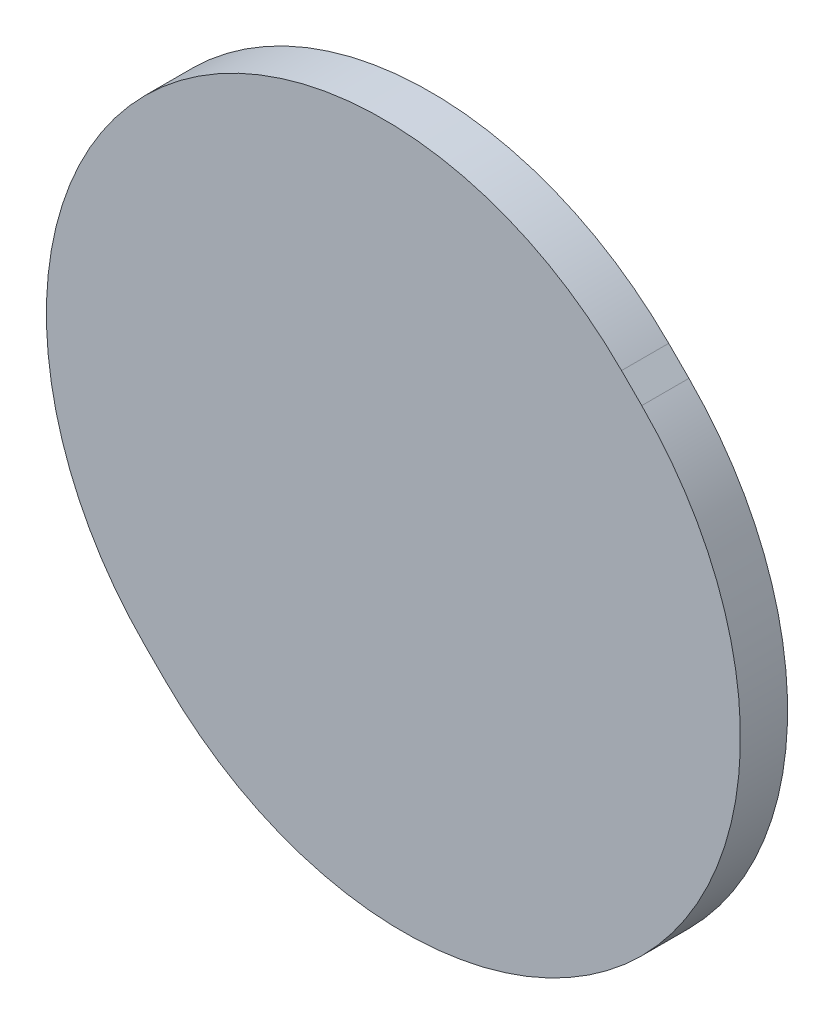
ISO-10303-21;
HEADER;
FILE_DESCRIPTION(('STEP AP214'),'2;1');
FILE_NAME('part.step','',(''),(''),'','','');
FILE_SCHEMA(('AUTOMOTIVE_DESIGN { 1 0 10303 214 1 1 1 1 }'));
ENDSEC;
DATA;
#1=APPLICATION_CONTEXT('core data for automotive mechanical design processes');
#2=APPLICATION_PROTOCOL_DEFINITION('international standard','automotive_design',2000,#1);
#3=PRODUCT_CONTEXT('',#1,'mechanical');
#4=PRODUCT('Part','Part','',(#3));
#5=PRODUCT_RELATED_PRODUCT_CATEGORY('part','',(#4));
#6=PRODUCT_DEFINITION_FORMATION('','',#4);
#7=PRODUCT_DEFINITION_CONTEXT('part definition',#1,'design');
#8=PRODUCT_DEFINITION('design','',#6,#7);
#9=PRODUCT_DEFINITION_SHAPE('','',#8);
#10=(LENGTH_UNIT() NAMED_UNIT(*) SI_UNIT(.MILLI.,.METRE.));
#11=(NAMED_UNIT(*) PLANE_ANGLE_UNIT() SI_UNIT($,.RADIAN.));
#12=(NAMED_UNIT(*) SI_UNIT($,.STERADIAN.) SOLID_ANGLE_UNIT());
#13=UNCERTAINTY_MEASURE_WITH_UNIT(LENGTH_MEASURE(1.E-05),#10,'distance_accuracy_value','');
#14=(GEOMETRIC_REPRESENTATION_CONTEXT(3) GLOBAL_UNCERTAINTY_ASSIGNED_CONTEXT((#13)) GLOBAL_UNIT_ASSIGNED_CONTEXT((#10,
#11,#12)) REPRESENTATION_CONTEXT('',''));
#15=CARTESIAN_POINT('',(0.,0.,0.));
#16=DIRECTION('',(0.,0.,1.));
#17=DIRECTION('',(1.,0.,0.));
#18=AXIS2_PLACEMENT_3D('',#15,#16,#17);
#19=CARTESIAN_POINT('',(145.168223,-116.711776,1.635));
#20=DIRECTION('',(0.,0.,1.));
#21=DIRECTION('',(1.,0.,0.));
#22=AXIS2_PLACEMENT_3D('',#19,#20,#21);
#23=PLANE('',#22);
#24=DIRECTION('',(0.707106781186048,-0.707106781187048,0.));
#25=VECTOR('',#24,1.);
#26=CARTESIAN_POINT('',(145.168223,-116.711776,1.635));
#27=LINE('',#26,#25);
#28=CARTESIAN_POINT('',(145.168223,-116.711776,1.635));
#29=VERTEX_POINT('',#28);
#30=CARTESIAN_POINT('',(145.183223,-116.726776,1.635));
#31=VERTEX_POINT('',#30);
#32=EDGE_CURVE('E80',#29,#31,#27,.T.);
#33=ORIENTED_EDGE('',*,*,#32,.T.);
#34=CARTESIAN_POINT('',(145.3599995,-116.5499995,1.635));
#35=DIRECTION('',(0.,0.,1.));
#36=DIRECTION('',(-0.707106781186548,-0.707106781186548,0.));
#37=AXIS2_PLACEMENT_3D('',#34,#35,#36);
#38=CIRCLE('',#37,0.249999723809);
#39=CARTESIAN_POINT('',(145.536776,-116.373223,1.635));
#40=VERTEX_POINT('',#39);
#41=EDGE_CURVE('E78',#31,#40,#38,.T.);
#42=ORIENTED_EDGE('',*,*,#41,.T.);
#43=DIRECTION('',(-0.707106781187048,0.707106781186048,0.));
#44=VECTOR('',#43,1.);
#45=CARTESIAN_POINT('',(145.536776,-116.373223,1.635));
#46=LINE('',#45,#44);
#47=CARTESIAN_POINT('',(145.521776,-116.358223,1.635));
#48=VERTEX_POINT('',#47);
#49=EDGE_CURVE('E66',#40,#48,#46,.T.);
#50=ORIENTED_EDGE('',*,*,#49,.T.);
#51=CARTESIAN_POINT('',(145.3449995,-116.5349995,1.635));
#52=DIRECTION('',(0.,0.,1.));
#53=DIRECTION('',(0.707106781186548,0.707106781186548,0.));
#54=AXIS2_PLACEMENT_3D('',#51,#52,#53);
#55=CIRCLE('',#54,0.249999723809);
#56=EDGE_CURVE('E11',#48,#29,#55,.T.);
#57=ORIENTED_EDGE('',*,*,#56,.T.);
#58=EDGE_LOOP('',(#33,#42,#50,#57));
#59=FACE_BOUND('',#58,.T.);
#60=ADVANCED_FACE('F17',(#59),#23,.T.);
#61=CARTESIAN_POINT('',(145.168223,-116.711776,1.6));
#62=DIRECTION('',(0.,0.,1.));
#63=DIRECTION('',(1.,0.,0.));
#64=AXIS2_PLACEMENT_3D('',#61,#62,#63);
#65=PLANE('',#64);
#66=CARTESIAN_POINT('',(145.3449995,-116.5349995,1.6));
#67=DIRECTION('',(0.,0.,1.));
#68=DIRECTION('',(0.707106781186548,0.707106781186548,0.));
#69=AXIS2_PLACEMENT_3D('',#66,#67,#68);
#70=CIRCLE('',#69,0.249999723809);
#71=CARTESIAN_POINT('',(145.521776,-116.358223,1.6));
#72=VERTEX_POINT('',#71);
#73=CARTESIAN_POINT('',(145.168223,-116.711776,1.6));
#74=VERTEX_POINT('',#73);
#75=EDGE_CURVE('E27',#72,#74,#70,.T.);
#76=ORIENTED_EDGE('',*,*,#75,.F.);
#77=DIRECTION('',(-0.707106781187048,0.707106781186048,0.));
#78=VECTOR('',#77,1.);
#79=CARTESIAN_POINT('',(145.536776,-116.373223,1.6));
#80=LINE('',#79,#78);
#81=CARTESIAN_POINT('',(145.536776,-116.373223,1.6));
#82=VERTEX_POINT('',#81);
#83=EDGE_CURVE('E85',#82,#72,#80,.T.);
#84=ORIENTED_EDGE('',*,*,#83,.F.);
#85=CARTESIAN_POINT('',(145.3599995,-116.5499995,1.6));
#86=DIRECTION('',(0.,0.,1.));
#87=DIRECTION('',(-0.707106781186548,-0.707106781186548,0.));
#88=AXIS2_PLACEMENT_3D('',#85,#86,#87);
#89=CIRCLE('',#88,0.249999723809);
#90=CARTESIAN_POINT('',(145.183223,-116.726776,1.6));
#91=VERTEX_POINT('',#90);
#92=EDGE_CURVE('E88',#91,#82,#89,.T.);
#93=ORIENTED_EDGE('',*,*,#92,.F.);
#94=DIRECTION('',(0.707106781186048,-0.707106781187048,0.));
#95=VECTOR('',#94,1.);
#96=CARTESIAN_POINT('',(145.168223,-116.711776,1.6));
#97=LINE('',#96,#95);
#98=EDGE_CURVE('E116',#74,#91,#97,.T.);
#99=ORIENTED_EDGE('',*,*,#98,.F.);
#100=EDGE_LOOP('',(#76,#84,#93,#99));
#101=FACE_BOUND('',#100,.T.);
#102=ADVANCED_FACE('F127',(#101),#65,.F.);
#103=CARTESIAN_POINT('',(145.3449995,-116.5349995,1.6));
#104=DIRECTION('',(0.,0.,-1.));
#105=DIRECTION('',(0.707106781186548,0.707106781186548,0.));
#106=AXIS2_PLACEMENT_3D('',#103,#104,#105);
#107=CYLINDRICAL_SURFACE('',#106,0.249999723809);
#108=ORIENTED_EDGE('',*,*,#75,.T.);
#109=DIRECTION('',(0.,0.,1.));
#110=VECTOR('',#109,1.);
#111=CARTESIAN_POINT('',(145.168223,-116.711776,1.6));
#112=LINE('',#111,#110);
#113=EDGE_CURVE('E95',#74,#29,#112,.T.);
#114=ORIENTED_EDGE('',*,*,#113,.T.);
#115=ORIENTED_EDGE('',*,*,#56,.F.);
#116=DIRECTION('',(0.,0.,1.));
#117=VECTOR('',#116,1.);
#118=CARTESIAN_POINT('',(145.521776,-116.358223,1.6));
#119=LINE('',#118,#117);
#120=EDGE_CURVE('E73',#72,#48,#119,.T.);
#121=ORIENTED_EDGE('',*,*,#120,.F.);
#122=EDGE_LOOP('',(#108,#114,#115,#121));
#123=FACE_BOUND('',#122,.T.);
#124=ADVANCED_FACE('F19',(#123),#107,.T.);
#125=CARTESIAN_POINT('',(145.536776,-116.373223,1.6));
#126=DIRECTION('',(-0.707106781186048,-0.707106781187048,0.));
#127=DIRECTION('',(-0.707106781187048,0.707106781186048,0.));
#128=AXIS2_PLACEMENT_3D('',#125,#126,#127);
#129=PLANE('',#128);
#130=ORIENTED_EDGE('',*,*,#83,.T.);
#131=ORIENTED_EDGE('',*,*,#120,.T.);
#132=ORIENTED_EDGE('',*,*,#49,.F.);
#133=DIRECTION('',(0.,0.,1.));
#134=VECTOR('',#133,1.);
#135=CARTESIAN_POINT('',(145.536776,-116.373223,1.6));
#136=LINE('',#135,#134);
#137=EDGE_CURVE('E71',#82,#40,#136,.T.);
#138=ORIENTED_EDGE('',*,*,#137,.F.);
#139=EDGE_LOOP('',(#130,#131,#132,#138));
#140=FACE_BOUND('',#139,.T.);
#141=ADVANCED_FACE('F69',(#140),#129,.F.);
#142=CARTESIAN_POINT('',(145.3599995,-116.5499995,1.6));
#143=DIRECTION('',(0.,0.,-1.));
#144=DIRECTION('',(-0.707106781186548,-0.707106781186548,0.));
#145=AXIS2_PLACEMENT_3D('',#142,#143,#144);
#146=CYLINDRICAL_SURFACE('',#145,0.249999723809);
#147=ORIENTED_EDGE('',*,*,#92,.T.);
#148=ORIENTED_EDGE('',*,*,#137,.T.);
#149=ORIENTED_EDGE('',*,*,#41,.F.);
#150=DIRECTION('',(0.,0.,1.));
#151=VECTOR('',#150,1.);
#152=CARTESIAN_POINT('',(145.183223,-116.726776,1.6));
#153=LINE('',#152,#151);
#154=EDGE_CURVE('E112',#91,#31,#153,.T.);
#155=ORIENTED_EDGE('',*,*,#154,.F.);
#156=EDGE_LOOP('',(#147,#148,#149,#155));
#157=FACE_BOUND('',#156,.T.);
#158=ADVANCED_FACE('F87',(#157),#146,.T.);
#159=CARTESIAN_POINT('',(145.168223,-116.711776,1.6));
#160=DIRECTION('',(0.707106781187048,0.707106781186048,0.));
#161=DIRECTION('',(0.,0.,-1.));
#162=AXIS2_PLACEMENT_3D('',#159,#160,#161);
#163=PLANE('',#162);
#164=ORIENTED_EDGE('',*,*,#98,.T.);
#165=ORIENTED_EDGE('',*,*,#154,.T.);
#166=ORIENTED_EDGE('',*,*,#32,.F.);
#167=ORIENTED_EDGE('',*,*,#113,.F.);
#168=EDGE_LOOP('',(#164,#165,#166,#167));
#169=FACE_BOUND('',#168,.T.);
#170=ADVANCED_FACE('F125',(#169),#163,.F.);
#171=CLOSED_SHELL('',(#60,#102,#124,#141,#158,#170));
#172=MANIFOLD_SOLID_BREP('B1',#171);
#173=ADVANCED_BREP_SHAPE_REPRESENTATION('',(#18,#172),#14);
#174=SHAPE_DEFINITION_REPRESENTATION(#9,#173);
ENDSEC;
END-ISO-10303-21;
